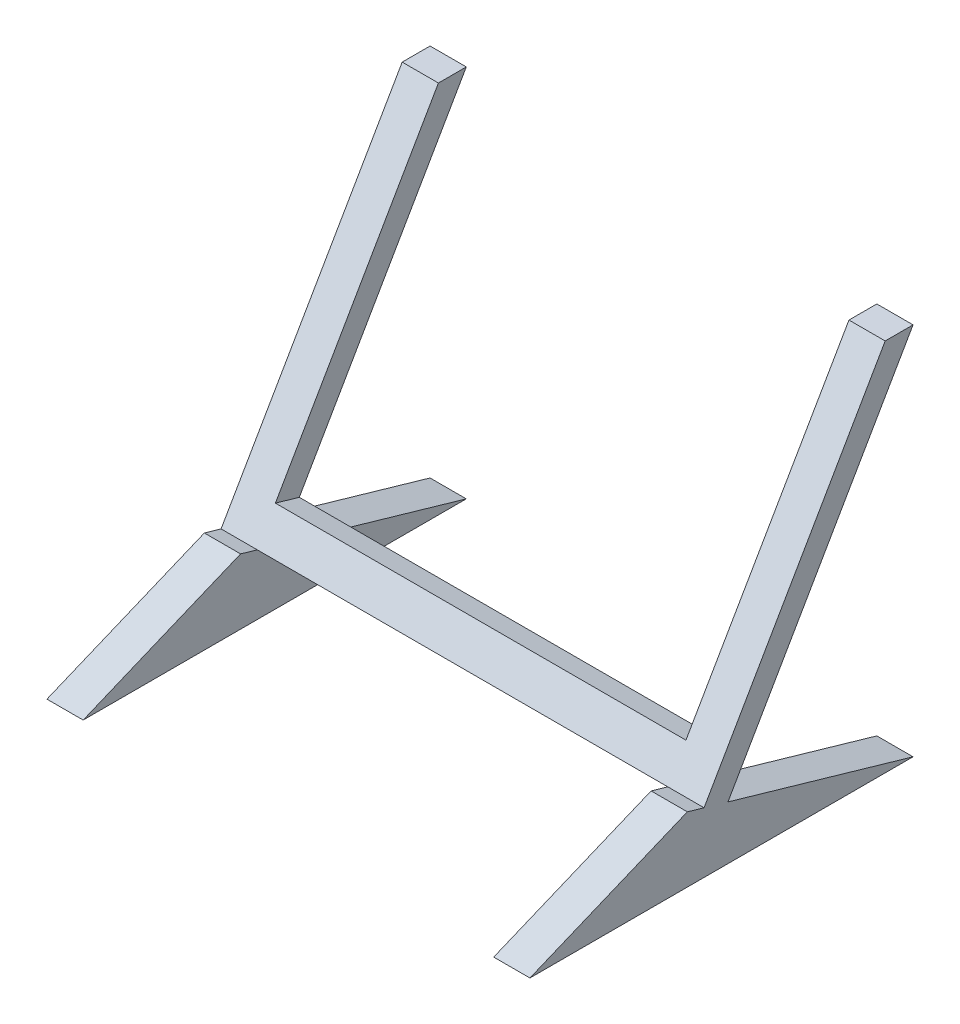
ISO-10303-21;
HEADER;
FILE_DESCRIPTION(('STEP AP214'),'2;1');
FILE_NAME('part.step','',(''),(''),'','','');
FILE_SCHEMA(('AUTOMOTIVE_DESIGN { 1 0 10303 214 1 1 1 1 }'));
ENDSEC;
DATA;
#1=APPLICATION_CONTEXT('core data for automotive mechanical design processes');
#2=APPLICATION_PROTOCOL_DEFINITION('international standard','automotive_design',2000,#1);
#3=PRODUCT_CONTEXT('',#1,'mechanical');
#4=PRODUCT('Part','Part','',(#3));
#5=PRODUCT_RELATED_PRODUCT_CATEGORY('part','',(#4));
#6=PRODUCT_DEFINITION_FORMATION('','',#4);
#7=PRODUCT_DEFINITION_CONTEXT('part definition',#1,'design');
#8=PRODUCT_DEFINITION('design','',#6,#7);
#9=PRODUCT_DEFINITION_SHAPE('','',#8);
#10=(LENGTH_UNIT() NAMED_UNIT(*) SI_UNIT(.MILLI.,.METRE.));
#11=(NAMED_UNIT(*) PLANE_ANGLE_UNIT() SI_UNIT($,.RADIAN.));
#12=(NAMED_UNIT(*) SI_UNIT($,.STERADIAN.) SOLID_ANGLE_UNIT());
#13=UNCERTAINTY_MEASURE_WITH_UNIT(LENGTH_MEASURE(1.E-05),#10,'distance_accuracy_value','');
#14=(GEOMETRIC_REPRESENTATION_CONTEXT(3) GLOBAL_UNCERTAINTY_ASSIGNED_CONTEXT((#13)) GLOBAL_UNIT_ASSIGNED_CONTEXT((#10,
#11,#12)) REPRESENTATION_CONTEXT('',''));
#15=CARTESIAN_POINT('',(0.,0.,0.));
#16=DIRECTION('',(0.,0.,1.));
#17=DIRECTION('',(1.,0.,0.));
#18=AXIS2_PLACEMENT_3D('',#15,#16,#17);
#19=CARTESIAN_POINT('',(3.,0.,0.));
#20=DIRECTION('',(-1.,0.,0.));
#21=DIRECTION('',(0.,0.,1.));
#22=AXIS2_PLACEMENT_3D('',#19,#20,#21);
#23=PLANE('',#22);
#24=DIRECTION('',(0.,-0.277514364515194,-0.960721487991046));
#25=VECTOR('',#24,1.);
#26=CARTESIAN_POINT('',(3.,4.4282571678945,-3.58541401211714));
#27=LINE('',#26,#25);
#28=CARTESIAN_POINT('',(3.,5.,-1.60610881338198));
#29=VERTEX_POINT('',#28);
#30=CARTESIAN_POINT('',(3.,4.4282571678945,-3.58541401211714));
#31=VERTEX_POINT('',#30);
#32=EDGE_CURVE('E108',#29,#31,#27,.T.);
#33=ORIENTED_EDGE('',*,*,#32,.F.);
#34=DIRECTION('',(0.,0.277514364515194,0.960721487991045));
#35=VECTOR('',#34,1.);
#36=CARTESIAN_POINT('',(3.,5.4,-0.221356727241309));
#37=LINE('',#36,#35);
#38=CARTESIAN_POINT('',(3.,5.4,-0.221356727241309));
#39=VERTEX_POINT('',#38);
#40=EDGE_CURVE('E111',#29,#39,#37,.T.);
#41=ORIENTED_EDGE('',*,*,#40,.T.);
#42=DIRECTION('',(0.,-0.382709611082151,0.923868688497098));
#43=VECTOR('',#42,1.);
#44=CARTESIAN_POINT('',(3.,0.,12.8143517405385));
#45=LINE('',#44,#43);
#46=CARTESIAN_POINT('',(3.,0.,12.8143517405385));
#47=VERTEX_POINT('',#46);
#48=EDGE_CURVE('E137',#39,#47,#45,.T.);
#49=ORIENTED_EDGE('',*,*,#48,.T.);
#50=DIRECTION('',(0.,0.,-1.));
#51=VECTOR('',#50,1.);
#52=CARTESIAN_POINT('',(3.,0.,-18.9155098901404));
#53=LINE('',#52,#51);
#54=CARTESIAN_POINT('',(3.,0.,-18.9155098901404));
#55=VERTEX_POINT('',#54);
#56=EDGE_CURVE('E57',#47,#55,#53,.T.);
#57=ORIENTED_EDGE('',*,*,#56,.T.);
#58=DIRECTION('',(0.,0.277514364515194,0.960721487991045));
#59=VECTOR('',#58,1.);
#60=CARTESIAN_POINT('',(3.,4.4282571678945,-3.58541401211714));
#61=LINE('',#60,#59);
#62=EDGE_CURVE('E96',#55,#31,#61,.T.);
#63=ORIENTED_EDGE('',*,*,#62,.T.);
#64=EDGE_LOOP('',(#33,#41,#49,#57,#63));
#65=FACE_BOUND('',#64,.T.);
#66=ADVANCED_FACE('F33',(#65),#23,.F.);
#67=DIRECTION('',(0.,0.277514364515193,0.960721487991046));
#68=VECTOR('',#67,1.);
#69=CARTESIAN_POINT('',(3.,7.02633337924783,-5.08541401211713));
#70=LINE('',#69,#68);
#71=CARTESIAN_POINT('',(3.,7.02633337924783,-5.08541401211713));
#72=VERTEX_POINT('',#71);
#73=CARTESIAN_POINT('',(3.,7.59807621135332,-3.10610881338198));
#74=VERTEX_POINT('',#73);
#75=EDGE_CURVE('E48',#72,#74,#70,.T.);
#76=ORIENTED_EDGE('',*,*,#75,.F.);
#77=DIRECTION('',(0.,0.86602540378444,-0.499999999999998));
#78=VECTOR('',#77,1.);
#79=CARTESIAN_POINT('',(3.,30.9807621135332,-18.9155098901404));
#80=LINE('',#79,#78);
#81=CARTESIAN_POINT('',(3.,30.9807621135332,-18.9155098901404));
#82=VERTEX_POINT('',#81);
#83=EDGE_CURVE('E157',#72,#82,#80,.T.);
#84=ORIENTED_EDGE('',*,*,#83,.T.);
#85=DIRECTION('',(0.,0.,1.));
#86=VECTOR('',#85,1.);
#87=CARTESIAN_POINT('',(3.,30.9807621135332,-16.6061088133819));
#88=LINE('',#87,#86);
#89=CARTESIAN_POINT('',(3.,30.9807621135332,-16.6061088133819));
#90=VERTEX_POINT('',#89);
#91=EDGE_CURVE('E159',#82,#90,#88,.T.);
#92=ORIENTED_EDGE('',*,*,#91,.T.);
#93=DIRECTION('',(0.,-0.86602540378444,0.499999999999998));
#94=VECTOR('',#93,1.);
#95=CARTESIAN_POINT('',(3.,5.,-1.60610881338198));
#96=LINE('',#95,#94);
#97=EDGE_CURVE('E138',#90,#74,#96,.T.);
#98=ORIENTED_EDGE('',*,*,#97,.T.);
#99=EDGE_LOOP('',(#76,#84,#92,#98));
#100=FACE_BOUND('',#99,.T.);
#101=ADVANCED_FACE('F198',(#100),#23,.F.);
#102=CARTESIAN_POINT('',(3.,4.4282571678945,-3.58541401211714));
#103=DIRECTION('',(0.,-0.960721487991045,0.277514364515194));
#104=DIRECTION('',(0.,-0.277514364515194,-0.960721487991045));
#105=AXIS2_PLACEMENT_3D('',#102,#103,#104);
#106=PLANE('',#105);
#107=DIRECTION('',(0.,0.277514364515194,0.960721487991045));
#108=VECTOR('',#107,1.);
#109=CARTESIAN_POINT('',(0.,4.4282571678945,-3.58541401211714));
#110=LINE('',#109,#108);
#111=CARTESIAN_POINT('',(0.,0.,-18.9155098901404));
#112=VERTEX_POINT('',#111);
#113=CARTESIAN_POINT('',(0.,4.4282571678945,-3.58541401211714));
#114=VERTEX_POINT('',#113);
#115=EDGE_CURVE('E153',#112,#114,#110,.T.);
#116=ORIENTED_EDGE('',*,*,#115,.T.);
#117=DIRECTION('',(-1.,0.,0.));
#118=VECTOR('',#117,1.);
#119=CARTESIAN_POINT('',(3.,4.4282571678945,-3.58541401211714));
#120=LINE('',#119,#118);
#121=EDGE_CURVE('E41',#31,#114,#120,.T.);
#122=ORIENTED_EDGE('',*,*,#121,.F.);
#123=ORIENTED_EDGE('',*,*,#62,.F.);
#124=DIRECTION('',(-1.,0.,0.));
#125=VECTOR('',#124,1.);
#126=CARTESIAN_POINT('',(3.,0.,-18.9155098901404));
#127=LINE('',#126,#125);
#128=EDGE_CURVE('E11',#55,#112,#127,.T.);
#129=ORIENTED_EDGE('',*,*,#128,.T.);
#130=EDGE_LOOP('',(#116,#122,#123,#129));
#131=FACE_BOUND('',#130,.T.);
#132=ADVANCED_FACE('F35',(#131),#106,.F.);
#133=CARTESIAN_POINT('',(3.,30.9807621135332,-18.9155098901404));
#134=DIRECTION('',(0.,0.499999999999998,0.86602540378444));
#135=DIRECTION('',(0.,-0.86602540378444,0.499999999999998));
#136=AXIS2_PLACEMENT_3D('',#133,#134,#135);
#137=PLANE('',#136);
#138=DIRECTION('',(0.,0.86602540378444,-0.499999999999998));
#139=VECTOR('',#138,1.);
#140=CARTESIAN_POINT('',(0.,30.9807621135332,-18.9155098901404));
#141=LINE('',#140,#139);
#142=CARTESIAN_POINT('',(0.,30.9807621135332,-18.9155098901404));
#143=VERTEX_POINT('',#142);
#144=EDGE_CURVE('E165',#114,#143,#141,.T.);
#145=ORIENTED_EDGE('',*,*,#144,.T.);
#146=DIRECTION('',(-1.,0.,0.));
#147=VECTOR('',#146,1.);
#148=CARTESIAN_POINT('',(3.,30.9807621135332,-18.9155098901404));
#149=LINE('',#148,#147);
#150=EDGE_CURVE('E177',#82,#143,#149,.T.);
#151=ORIENTED_EDGE('',*,*,#150,.F.);
#152=ORIENTED_EDGE('',*,*,#83,.F.);
#153=DIRECTION('',(1.,0.,0.));
#154=VECTOR('',#153,1.);
#155=CARTESIAN_POINT('',(-1.70673107732103,7.02633337924783,-5.08541401211713));
#156=LINE('',#155,#154);
#157=CARTESIAN_POINT('',(37.,7.02633337924783,-5.08541401211713));
#158=VERTEX_POINT('',#157);
#159=EDGE_CURVE('E150',#72,#158,#156,.T.);
#160=ORIENTED_EDGE('',*,*,#159,.T.);
#161=DIRECTION('',(0.,0.86602540378444,-0.499999999999998));
#162=VECTOR('',#161,1.);
#163=CARTESIAN_POINT('',(37.,30.9807621135332,-18.9155098901404));
#164=LINE('',#163,#162);
#165=CARTESIAN_POINT('',(37.,30.9807621135332,-18.9155098901404));
#166=VERTEX_POINT('',#165);
#167=EDGE_CURVE('E276',#158,#166,#164,.T.);
#168=ORIENTED_EDGE('',*,*,#167,.T.);
#169=DIRECTION('',(1.,0.,0.));
#170=VECTOR('',#169,1.);
#171=CARTESIAN_POINT('',(37.,30.9807621135332,-18.9155098901404));
#172=LINE('',#171,#170);
#173=CARTESIAN_POINT('',(40.,30.9807621135332,-18.9155098901404));
#174=VERTEX_POINT('',#173);
#175=EDGE_CURVE('E300',#166,#174,#172,.T.);
#176=ORIENTED_EDGE('',*,*,#175,.T.);
#177=DIRECTION('',(0.,0.86602540378444,-0.499999999999998));
#178=VECTOR('',#177,1.);
#179=CARTESIAN_POINT('',(40.,30.9807621135332,-18.9155098901404));
#180=LINE('',#179,#178);
#181=CARTESIAN_POINT('',(40.,4.4282571678945,-3.58541401211714));
#182=VERTEX_POINT('',#181);
#183=EDGE_CURVE('E292',#182,#174,#180,.T.);
#184=ORIENTED_EDGE('',*,*,#183,.F.);
#185=DIRECTION('',(1.,0.,0.));
#186=VECTOR('',#185,1.);
#187=CARTESIAN_POINT('',(37.,4.4282571678945,-3.58541401211714));
#188=LINE('',#187,#186);
#189=CARTESIAN_POINT('',(37.,4.4282571678945,-3.58541401211714));
#190=VERTEX_POINT('',#189);
#191=EDGE_CURVE('E298',#190,#182,#188,.T.);
#192=ORIENTED_EDGE('',*,*,#191,.F.);
#193=DIRECTION('',(1.,0.,0.));
#194=VECTOR('',#193,1.);
#195=CARTESIAN_POINT('',(-1.70673107732103,4.4282571678945,-3.58541401211714));
#196=LINE('',#195,#194);
#197=EDGE_CURVE('E116',#31,#190,#196,.T.);
#198=ORIENTED_EDGE('',*,*,#197,.F.);
#199=ORIENTED_EDGE('',*,*,#121,.T.);
#200=EDGE_LOOP('',(#145,#151,#152,#160,#168,#176,#184,#192,#198,#199));
#201=FACE_BOUND('',#200,.T.);
#202=ADVANCED_FACE('F183',(#201),#137,.F.);
#203=CARTESIAN_POINT('',(3.,30.9807621135332,-16.6061088133819));
#204=DIRECTION('',(0.,-1.,0.));
#205=DIRECTION('',(0.,0.,-1.));
#206=AXIS2_PLACEMENT_3D('',#203,#204,#205);
#207=PLANE('',#206);
#208=DIRECTION('',(0.,0.,1.));
#209=VECTOR('',#208,1.);
#210=CARTESIAN_POINT('',(0.,30.9807621135332,-16.6061088133819));
#211=LINE('',#210,#209);
#212=CARTESIAN_POINT('',(0.,30.9807621135332,-16.6061088133819));
#213=VERTEX_POINT('',#212);
#214=EDGE_CURVE('E167',#143,#213,#211,.T.);
#215=ORIENTED_EDGE('',*,*,#214,.T.);
#216=DIRECTION('',(-1.,0.,0.));
#217=VECTOR('',#216,1.);
#218=CARTESIAN_POINT('',(3.,30.9807621135332,-16.6061088133819));
#219=LINE('',#218,#217);
#220=EDGE_CURVE('E132',#90,#213,#219,.T.);
#221=ORIENTED_EDGE('',*,*,#220,.F.);
#222=ORIENTED_EDGE('',*,*,#91,.F.);
#223=ORIENTED_EDGE('',*,*,#150,.T.);
#224=EDGE_LOOP('',(#215,#221,#222,#223));
#225=FACE_BOUND('',#224,.T.);
#226=ADVANCED_FACE('F193',(#225),#207,.F.);
#227=CARTESIAN_POINT('',(3.,5.,-1.60610881338198));
#228=DIRECTION('',(0.,-0.499999999999998,-0.86602540378444));
#229=DIRECTION('',(0.,0.86602540378444,-0.499999999999998));
#230=AXIS2_PLACEMENT_3D('',#227,#228,#229);
#231=PLANE('',#230);
#232=DIRECTION('',(0.,-0.86602540378444,0.499999999999998));
#233=VECTOR('',#232,1.);
#234=CARTESIAN_POINT('',(0.,5.,-1.60610881338198));
#235=LINE('',#234,#233);
#236=CARTESIAN_POINT('',(0.,5.,-1.60610881338198));
#237=VERTEX_POINT('',#236);
#238=EDGE_CURVE('E129',#213,#237,#235,.T.);
#239=ORIENTED_EDGE('',*,*,#238,.T.);
#240=DIRECTION('',(-1.,0.,0.));
#241=VECTOR('',#240,1.);
#242=CARTESIAN_POINT('',(3.,5.,-1.60610881338198));
#243=LINE('',#242,#241);
#244=EDGE_CURVE('E122',#29,#237,#243,.T.);
#245=ORIENTED_EDGE('',*,*,#244,.F.);
#246=DIRECTION('',(1.,0.,0.));
#247=VECTOR('',#246,1.);
#248=CARTESIAN_POINT('',(-1.70673107732103,5.,-1.60610881338198));
#249=LINE('',#248,#247);
#250=CARTESIAN_POINT('',(37.,5.,-1.60610881338198));
#251=VERTEX_POINT('',#250);
#252=EDGE_CURVE('E117',#29,#251,#249,.T.);
#253=ORIENTED_EDGE('',*,*,#252,.T.);
#254=DIRECTION('',(1.,0.,0.));
#255=VECTOR('',#254,1.);
#256=CARTESIAN_POINT('',(37.,5.,-1.60610881338198));
#257=LINE('',#256,#255);
#258=CARTESIAN_POINT('',(40.,5.,-1.60610881338198));
#259=VERTEX_POINT('',#258);
#260=EDGE_CURVE('E304',#251,#259,#257,.T.);
#261=ORIENTED_EDGE('',*,*,#260,.T.);
#262=DIRECTION('',(0.,-0.86602540378444,0.499999999999998));
#263=VECTOR('',#262,1.);
#264=CARTESIAN_POINT('',(40.,5.,-1.60610881338198));
#265=LINE('',#264,#263);
#266=CARTESIAN_POINT('',(40.,30.9807621135332,-16.6061088133819));
#267=VERTEX_POINT('',#266);
#268=EDGE_CURVE('E286',#267,#259,#265,.T.);
#269=ORIENTED_EDGE('',*,*,#268,.F.);
#270=DIRECTION('',(1.,0.,0.));
#271=VECTOR('',#270,1.);
#272=CARTESIAN_POINT('',(37.,30.9807621135332,-16.6061088133819));
#273=LINE('',#272,#271);
#274=CARTESIAN_POINT('',(37.,30.9807621135332,-16.6061088133819));
#275=VERTEX_POINT('',#274);
#276=EDGE_CURVE('E302',#275,#267,#273,.T.);
#277=ORIENTED_EDGE('',*,*,#276,.F.);
#278=DIRECTION('',(0.,-0.86602540378444,0.499999999999998));
#279=VECTOR('',#278,1.);
#280=CARTESIAN_POINT('',(37.,5.,-1.60610881338198));
#281=LINE('',#280,#279);
#282=CARTESIAN_POINT('',(37.,7.59807621135332,-3.10610881338198));
#283=VERTEX_POINT('',#282);
#284=EDGE_CURVE('E269',#275,#283,#281,.T.);
#285=ORIENTED_EDGE('',*,*,#284,.T.);
#286=DIRECTION('',(1.,0.,0.));
#287=VECTOR('',#286,1.);
#288=CARTESIAN_POINT('',(-1.70673107732103,7.59807621135332,-3.10610881338198));
#289=LINE('',#288,#287);
#290=EDGE_CURVE('E144',#74,#283,#289,.T.);
#291=ORIENTED_EDGE('',*,*,#290,.F.);
#292=ORIENTED_EDGE('',*,*,#97,.F.);
#293=ORIENTED_EDGE('',*,*,#220,.T.);
#294=EDGE_LOOP('',(#239,#245,#253,#261,#269,#277,#285,#291,#292,#293));
#295=FACE_BOUND('',#294,.T.);
#296=ADVANCED_FACE('F123',(#295),#231,.F.);
#297=CARTESIAN_POINT('',(3.,5.4,-0.221356727241309));
#298=DIRECTION('',(0.,-0.960721487991045,0.277514364515194));
#299=DIRECTION('',(0.,-0.277514364515194,-0.960721487991045));
#300=AXIS2_PLACEMENT_3D('',#297,#298,#299);
#301=PLANE('',#300);
#302=DIRECTION('',(0.,0.277514364515194,0.960721487991045));
#303=VECTOR('',#302,1.);
#304=CARTESIAN_POINT('',(0.,5.4,-0.221356727241309));
#305=LINE('',#304,#303);
#306=CARTESIAN_POINT('',(0.,5.4,-0.221356727241309));
#307=VERTEX_POINT('',#306);
#308=EDGE_CURVE('E170',#237,#307,#305,.T.);
#309=ORIENTED_EDGE('',*,*,#308,.T.);
#310=DIRECTION('',(-1.,0.,0.));
#311=VECTOR('',#310,1.);
#312=CARTESIAN_POINT('',(3.,5.4,-0.221356727241309));
#313=LINE('',#312,#311);
#314=EDGE_CURVE('E133',#39,#307,#313,.T.);
#315=ORIENTED_EDGE('',*,*,#314,.F.);
#316=ORIENTED_EDGE('',*,*,#40,.F.);
#317=ORIENTED_EDGE('',*,*,#244,.T.);
#318=EDGE_LOOP('',(#309,#315,#316,#317));
#319=FACE_BOUND('',#318,.T.);
#320=ADVANCED_FACE('F135',(#319),#301,.F.);
#321=CARTESIAN_POINT('',(3.,0.,12.8143517405385));
#322=DIRECTION('',(0.,-0.923868688497098,-0.382709611082151));
#323=DIRECTION('',(0.,0.382709611082152,-0.923868688497098));
#324=AXIS2_PLACEMENT_3D('',#321,#322,#323);
#325=PLANE('',#324);
#326=DIRECTION('',(0.,-0.382709611082151,0.923868688497098));
#327=VECTOR('',#326,1.);
#328=CARTESIAN_POINT('',(0.,0.,12.8143517405385));
#329=LINE('',#328,#327);
#330=CARTESIAN_POINT('',(0.,0.,12.8143517405385));
#331=VERTEX_POINT('',#330);
#332=EDGE_CURVE('E89',#307,#331,#329,.T.);
#333=ORIENTED_EDGE('',*,*,#332,.T.);
#334=DIRECTION('',(-1.,0.,0.));
#335=VECTOR('',#334,1.);
#336=CARTESIAN_POINT('',(3.,0.,12.8143517405385));
#337=LINE('',#336,#335);
#338=EDGE_CURVE('E163',#47,#331,#337,.T.);
#339=ORIENTED_EDGE('',*,*,#338,.F.);
#340=ORIENTED_EDGE('',*,*,#48,.F.);
#341=ORIENTED_EDGE('',*,*,#314,.T.);
#342=EDGE_LOOP('',(#333,#339,#340,#341));
#343=FACE_BOUND('',#342,.T.);
#344=ADVANCED_FACE('F354',(#343),#325,.F.);
#345=CARTESIAN_POINT('',(3.,0.,0.));
#346=DIRECTION('',(0.,1.,0.));
#347=DIRECTION('',(0.,0.,1.));
#348=AXIS2_PLACEMENT_3D('',#345,#346,#347);
#349=PLANE('',#348);
#350=DIRECTION('',(0.,0.,-1.));
#351=VECTOR('',#350,1.);
#352=CARTESIAN_POINT('',(0.,0.,0.));
#353=LINE('',#352,#351);
#354=EDGE_CURVE('E155',#331,#112,#353,.T.);
#355=ORIENTED_EDGE('',*,*,#354,.T.);
#356=ORIENTED_EDGE('',*,*,#128,.F.);
#357=ORIENTED_EDGE('',*,*,#56,.F.);
#358=ORIENTED_EDGE('',*,*,#338,.T.);
#359=EDGE_LOOP('',(#355,#356,#357,#358));
#360=FACE_BOUND('',#359,.T.);
#361=ADVANCED_FACE('F351',(#360),#349,.F.);
#362=CARTESIAN_POINT('',(0.,0.,0.));
#363=DIRECTION('',(-1.,0.,0.));
#364=DIRECTION('',(0.,0.,1.));
#365=AXIS2_PLACEMENT_3D('',#362,#363,#364);
#366=PLANE('',#365);
#367=ORIENTED_EDGE('',*,*,#115,.F.);
#368=ORIENTED_EDGE('',*,*,#354,.F.);
#369=ORIENTED_EDGE('',*,*,#332,.F.);
#370=ORIENTED_EDGE('',*,*,#308,.F.);
#371=ORIENTED_EDGE('',*,*,#238,.F.);
#372=ORIENTED_EDGE('',*,*,#214,.F.);
#373=ORIENTED_EDGE('',*,*,#144,.F.);
#374=EDGE_LOOP('',(#367,#368,#369,#370,#371,#372,#373));
#375=FACE_BOUND('',#374,.T.);
#376=ADVANCED_FACE('F189',(#375),#366,.T.);
#377=CARTESIAN_POINT('',(-1.70673107732103,7.02633337924783,-5.08541401211713));
#378=DIRECTION('',(0.,0.960721487991046,-0.277514364515193));
#379=DIRECTION('',(0.,0.277514364515193,0.960721487991046));
#380=AXIS2_PLACEMENT_3D('',#377,#378,#379);
#381=PLANE('',#380);
#382=ORIENTED_EDGE('',*,*,#159,.F.);
#383=ORIENTED_EDGE('',*,*,#75,.T.);
#384=ORIENTED_EDGE('',*,*,#290,.T.);
#385=DIRECTION('',(0.,0.277514364515193,0.960721487991046));
#386=VECTOR('',#385,1.);
#387=CARTESIAN_POINT('',(37.,7.02633337924783,-5.08541401211713));
#388=LINE('',#387,#386);
#389=EDGE_CURVE('E307',#158,#283,#388,.T.);
#390=ORIENTED_EDGE('',*,*,#389,.F.);
#391=EDGE_LOOP('',(#382,#383,#384,#390));
#392=FACE_BOUND('',#391,.T.);
#393=ADVANCED_FACE('F313',(#392),#381,.T.);
#394=CARTESIAN_POINT('',(-1.70673107732103,4.4282571678945,-3.58541401211714));
#395=DIRECTION('',(0.,-0.960721487991045,0.277514364515193));
#396=DIRECTION('',(0.,-0.277514364515194,-0.960721487991046));
#397=AXIS2_PLACEMENT_3D('',#394,#395,#396);
#398=PLANE('',#397);
#399=ORIENTED_EDGE('',*,*,#252,.F.);
#400=ORIENTED_EDGE('',*,*,#32,.T.);
#401=ORIENTED_EDGE('',*,*,#197,.T.);
#402=DIRECTION('',(0.,-0.277514364515194,-0.960721487991046));
#403=VECTOR('',#402,1.);
#404=CARTESIAN_POINT('',(37.,4.4282571678945,-3.58541401211714));
#405=LINE('',#404,#403);
#406=EDGE_CURVE('E142',#251,#190,#405,.T.);
#407=ORIENTED_EDGE('',*,*,#406,.F.);
#408=EDGE_LOOP('',(#399,#400,#401,#407));
#409=FACE_BOUND('',#408,.T.);
#410=ADVANCED_FACE('F140',(#409),#398,.T.);
#411=CARTESIAN_POINT('',(37.,0.,0.));
#412=DIRECTION('',(1.,0.,0.));
#413=DIRECTION('',(0.,0.,1.));
#414=AXIS2_PLACEMENT_3D('',#411,#412,#413);
#415=PLANE('',#414);
#416=DIRECTION('',(0.,0.277514364515194,0.960721487991045));
#417=VECTOR('',#416,1.);
#418=CARTESIAN_POINT('',(37.,5.4,-0.221356727241309));
#419=LINE('',#418,#417);
#420=CARTESIAN_POINT('',(37.,5.4,-0.221356727241309));
#421=VERTEX_POINT('',#420);
#422=EDGE_CURVE('E267',#251,#421,#419,.T.);
#423=ORIENTED_EDGE('',*,*,#422,.F.);
#424=ORIENTED_EDGE('',*,*,#406,.T.);
#425=DIRECTION('',(0.,0.277514364515194,0.960721487991045));
#426=VECTOR('',#425,1.);
#427=CARTESIAN_POINT('',(37.,4.4282571678945,-3.58541401211714));
#428=LINE('',#427,#426);
#429=CARTESIAN_POINT('',(37.,0.,-18.9155098901404));
#430=VERTEX_POINT('',#429);
#431=EDGE_CURVE('E252',#430,#190,#428,.T.);
#432=ORIENTED_EDGE('',*,*,#431,.F.);
#433=DIRECTION('',(0.,0.,-1.));
#434=VECTOR('',#433,1.);
#435=CARTESIAN_POINT('',(37.,0.,-18.9155098901404));
#436=LINE('',#435,#434);
#437=CARTESIAN_POINT('',(37.,0.,12.8143517405385));
#438=VERTEX_POINT('',#437);
#439=EDGE_CURVE('E244',#438,#430,#436,.T.);
#440=ORIENTED_EDGE('',*,*,#439,.F.);
#441=DIRECTION('',(0.,-0.382709611082151,0.923868688497098));
#442=VECTOR('',#441,1.);
#443=CARTESIAN_POINT('',(37.,0.,12.8143517405385));
#444=LINE('',#443,#442);
#445=EDGE_CURVE('E249',#421,#438,#444,.T.);
#446=ORIENTED_EDGE('',*,*,#445,.F.);
#447=EDGE_LOOP('',(#423,#424,#432,#440,#446));
#448=FACE_BOUND('',#447,.T.);
#449=ADVANCED_FACE('F247',(#448),#415,.F.);
#450=ORIENTED_EDGE('',*,*,#167,.F.);
#451=ORIENTED_EDGE('',*,*,#389,.T.);
#452=ORIENTED_EDGE('',*,*,#284,.F.);
#453=DIRECTION('',(0.,0.,1.));
#454=VECTOR('',#453,1.);
#455=CARTESIAN_POINT('',(37.,30.9807621135332,-16.6061088133819));
#456=LINE('',#455,#454);
#457=EDGE_CURVE('E273',#166,#275,#456,.T.);
#458=ORIENTED_EDGE('',*,*,#457,.F.);
#459=EDGE_LOOP('',(#450,#451,#452,#458));
#460=FACE_BOUND('',#459,.T.);
#461=ADVANCED_FACE('F324',(#460),#415,.F.);
#462=CARTESIAN_POINT('',(37.,0.,0.));
#463=DIRECTION('',(0.,-1.,0.));
#464=DIRECTION('',(0.,0.,-1.));
#465=AXIS2_PLACEMENT_3D('',#462,#463,#464);
#466=PLANE('',#465);
#467=DIRECTION('',(0.,0.,-1.));
#468=VECTOR('',#467,1.);
#469=CARTESIAN_POINT('',(40.,0.,0.));
#470=LINE('',#469,#468);
#471=CARTESIAN_POINT('',(40.,0.,12.8143517405385));
#472=VERTEX_POINT('',#471);
#473=CARTESIAN_POINT('',(40.,0.,-18.9155098901404));
#474=VERTEX_POINT('',#473);
#475=EDGE_CURVE('E260',#472,#474,#470,.T.);
#476=ORIENTED_EDGE('',*,*,#475,.F.);
#477=DIRECTION('',(1.,0.,0.));
#478=VECTOR('',#477,1.);
#479=CARTESIAN_POINT('',(37.,0.,12.8143517405385));
#480=LINE('',#479,#478);
#481=EDGE_CURVE('E258',#438,#472,#480,.T.);
#482=ORIENTED_EDGE('',*,*,#481,.F.);
#483=ORIENTED_EDGE('',*,*,#439,.T.);
#484=DIRECTION('',(1.,0.,0.));
#485=VECTOR('',#484,1.);
#486=CARTESIAN_POINT('',(37.,0.,-18.9155098901404));
#487=LINE('',#486,#485);
#488=EDGE_CURVE('E279',#430,#474,#487,.T.);
#489=ORIENTED_EDGE('',*,*,#488,.T.);
#490=EDGE_LOOP('',(#476,#482,#483,#489));
#491=FACE_BOUND('',#490,.T.);
#492=ADVANCED_FACE('F259',(#491),#466,.T.);
#493=CARTESIAN_POINT('',(37.,0.,12.8143517405385));
#494=DIRECTION('',(0.,0.923868688497098,0.382709611082151));
#495=DIRECTION('',(0.,-0.382709611082152,0.923868688497098));
#496=AXIS2_PLACEMENT_3D('',#493,#494,#495);
#497=PLANE('',#496);
#498=DIRECTION('',(0.,-0.382709611082151,0.923868688497098));
#499=VECTOR('',#498,1.);
#500=CARTESIAN_POINT('',(40.,0.,12.8143517405385));
#501=LINE('',#500,#499);
#502=CARTESIAN_POINT('',(40.,5.4,-0.221356727241309));
#503=VERTEX_POINT('',#502);
#504=EDGE_CURVE('E281',#503,#472,#501,.T.);
#505=ORIENTED_EDGE('',*,*,#504,.F.);
#506=DIRECTION('',(1.,0.,0.));
#507=VECTOR('',#506,1.);
#508=CARTESIAN_POINT('',(37.,5.4,-0.221356727241309));
#509=LINE('',#508,#507);
#510=EDGE_CURVE('E264',#421,#503,#509,.T.);
#511=ORIENTED_EDGE('',*,*,#510,.F.);
#512=ORIENTED_EDGE('',*,*,#445,.T.);
#513=ORIENTED_EDGE('',*,*,#481,.T.);
#514=EDGE_LOOP('',(#505,#511,#512,#513));
#515=FACE_BOUND('',#514,.T.);
#516=ADVANCED_FACE('F266',(#515),#497,.T.);
#517=CARTESIAN_POINT('',(37.,5.4,-0.221356727241309));
#518=DIRECTION('',(0.,0.960721487991045,-0.277514364515194));
#519=DIRECTION('',(0.,0.277514364515194,0.960721487991045));
#520=AXIS2_PLACEMENT_3D('',#517,#518,#519);
#521=PLANE('',#520);
#522=DIRECTION('',(0.,0.277514364515194,0.960721487991045));
#523=VECTOR('',#522,1.);
#524=CARTESIAN_POINT('',(40.,5.4,-0.221356727241309));
#525=LINE('',#524,#523);
#526=EDGE_CURVE('E283',#259,#503,#525,.T.);
#527=ORIENTED_EDGE('',*,*,#526,.F.);
#528=ORIENTED_EDGE('',*,*,#260,.F.);
#529=ORIENTED_EDGE('',*,*,#422,.T.);
#530=ORIENTED_EDGE('',*,*,#510,.T.);
#531=EDGE_LOOP('',(#527,#528,#529,#530));
#532=FACE_BOUND('',#531,.T.);
#533=ADVANCED_FACE('F339',(#532),#521,.T.);
#534=CARTESIAN_POINT('',(37.,30.9807621135332,-16.6061088133819));
#535=DIRECTION('',(0.,1.,0.));
#536=DIRECTION('',(0.,0.,1.));
#537=AXIS2_PLACEMENT_3D('',#534,#535,#536);
#538=PLANE('',#537);
#539=DIRECTION('',(0.,0.,1.));
#540=VECTOR('',#539,1.);
#541=CARTESIAN_POINT('',(40.,30.9807621135332,-16.6061088133819));
#542=LINE('',#541,#540);
#543=EDGE_CURVE('E289',#174,#267,#542,.T.);
#544=ORIENTED_EDGE('',*,*,#543,.F.);
#545=ORIENTED_EDGE('',*,*,#175,.F.);
#546=ORIENTED_EDGE('',*,*,#457,.T.);
#547=ORIENTED_EDGE('',*,*,#276,.T.);
#548=EDGE_LOOP('',(#544,#545,#546,#547));
#549=FACE_BOUND('',#548,.T.);
#550=ADVANCED_FACE('F322',(#549),#538,.T.);
#551=CARTESIAN_POINT('',(37.,4.4282571678945,-3.58541401211714));
#552=DIRECTION('',(0.,0.960721487991045,-0.277514364515194));
#553=DIRECTION('',(0.,0.277514364515194,0.960721487991045));
#554=AXIS2_PLACEMENT_3D('',#551,#552,#553);
#555=PLANE('',#554);
#556=DIRECTION('',(0.,0.277514364515194,0.960721487991045));
#557=VECTOR('',#556,1.);
#558=CARTESIAN_POINT('',(40.,4.4282571678945,-3.58541401211714));
#559=LINE('',#558,#557);
#560=EDGE_CURVE('E255',#474,#182,#559,.T.);
#561=ORIENTED_EDGE('',*,*,#560,.F.);
#562=ORIENTED_EDGE('',*,*,#488,.F.);
#563=ORIENTED_EDGE('',*,*,#431,.T.);
#564=ORIENTED_EDGE('',*,*,#191,.T.);
#565=EDGE_LOOP('',(#561,#562,#563,#564));
#566=FACE_BOUND('',#565,.T.);
#567=ADVANCED_FACE('F331',(#566),#555,.T.);
#568=CARTESIAN_POINT('',(40.,0.,0.));
#569=DIRECTION('',(1.,0.,0.));
#570=DIRECTION('',(0.,0.,1.));
#571=AXIS2_PLACEMENT_3D('',#568,#569,#570);
#572=PLANE('',#571);
#573=ORIENTED_EDGE('',*,*,#475,.T.);
#574=ORIENTED_EDGE('',*,*,#560,.T.);
#575=ORIENTED_EDGE('',*,*,#183,.T.);
#576=ORIENTED_EDGE('',*,*,#543,.T.);
#577=ORIENTED_EDGE('',*,*,#268,.T.);
#578=ORIENTED_EDGE('',*,*,#526,.T.);
#579=ORIENTED_EDGE('',*,*,#504,.T.);
#580=EDGE_LOOP('',(#573,#574,#575,#576,#577,#578,#579));
#581=FACE_BOUND('',#580,.T.);
#582=ADVANCED_FACE('F328',(#581),#572,.T.);
#583=CLOSED_SHELL('',(#66,#101,#132,#202,#226,#296,#320,#344,#361,#376,#393,#410,#449,#461,#492,
#516,#533,#550,#567,#582));
#584=MANIFOLD_SOLID_BREP('B2',#583);
#585=ADVANCED_BREP_SHAPE_REPRESENTATION('',(#18,#584),#14);
#586=SHAPE_DEFINITION_REPRESENTATION(#9,#585);
ENDSEC;
END-ISO-10303-21;
